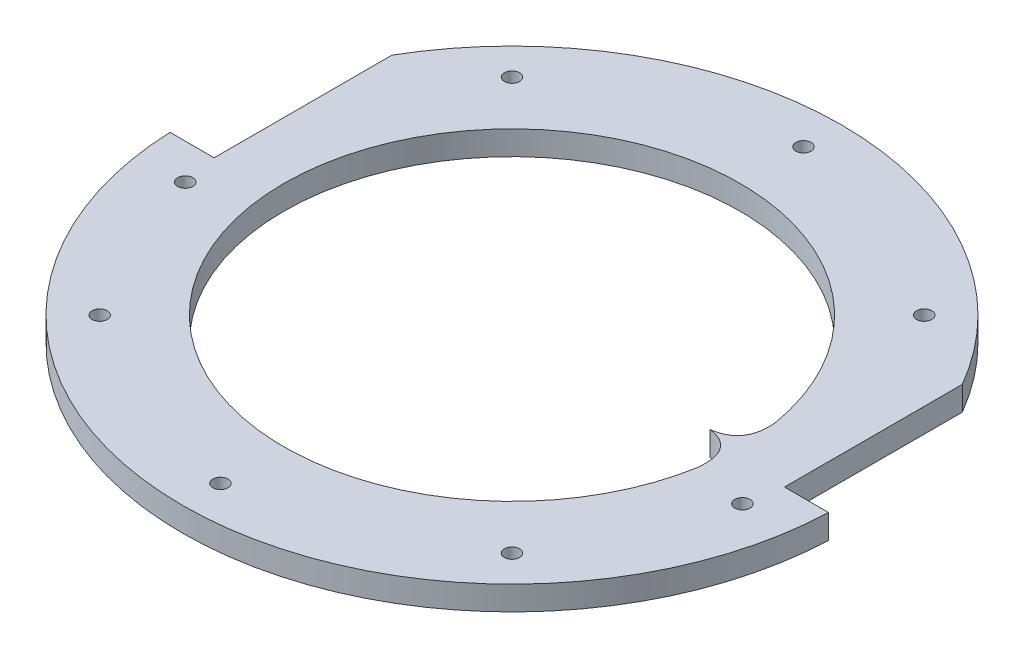
ISO-10303-21;
HEADER;
FILE_DESCRIPTION(('STEP AP214'),'2;1');
FILE_NAME('part.step','',(''),(''),'','','');
FILE_SCHEMA(('AUTOMOTIVE_DESIGN { 1 0 10303 214 1 1 1 1 }'));
ENDSEC;
DATA;
#1=APPLICATION_CONTEXT('core data for automotive mechanical design processes');
#2=APPLICATION_PROTOCOL_DEFINITION('international standard','automotive_design',2000,#1);
#3=PRODUCT_CONTEXT('',#1,'mechanical');
#4=PRODUCT('Part','Part','',(#3));
#5=PRODUCT_RELATED_PRODUCT_CATEGORY('part','',(#4));
#6=PRODUCT_DEFINITION_FORMATION('','',#4);
#7=PRODUCT_DEFINITION_CONTEXT('part definition',#1,'design');
#8=PRODUCT_DEFINITION('design','',#6,#7);
#9=PRODUCT_DEFINITION_SHAPE('','',#8);
#10=(LENGTH_UNIT() NAMED_UNIT(*) SI_UNIT(.MILLI.,.METRE.));
#11=(NAMED_UNIT(*) PLANE_ANGLE_UNIT() SI_UNIT($,.RADIAN.));
#12=(NAMED_UNIT(*) SI_UNIT($,.STERADIAN.) SOLID_ANGLE_UNIT());
#13=UNCERTAINTY_MEASURE_WITH_UNIT(LENGTH_MEASURE(1.E-05),#10,'distance_accuracy_value','');
#14=(GEOMETRIC_REPRESENTATION_CONTEXT(3) GLOBAL_UNCERTAINTY_ASSIGNED_CONTEXT((#13)) GLOBAL_UNIT_ASSIGNED_CONTEXT((#10,
#11,#12)) REPRESENTATION_CONTEXT('',''));
#15=CARTESIAN_POINT('',(0.,0.,0.));
#16=DIRECTION('',(0.,0.,1.));
#17=DIRECTION('',(1.,0.,0.));
#18=AXIS2_PLACEMENT_3D('',#15,#16,#17);
#19=CARTESIAN_POINT('',(0.,4.75,0.));
#20=DIRECTION('',(0.,1.,0.));
#21=DIRECTION('',(0.,0.,1.));
#22=AXIS2_PLACEMENT_3D('',#19,#20,#21);
#23=PLANE('',#22);
#24=CARTESIAN_POINT('',(0.,4.75,0.));
#25=DIRECTION('',(0.,1.,0.));
#26=DIRECTION('',(0.,0.,1.));
#27=AXIS2_PLACEMENT_3D('',#24,#25,#26);
#28=CIRCLE('',#27,65.);
#29=CARTESIAN_POINT('',(56.2499999999999,4.75,-32.5720355519887));
#30=VERTEX_POINT('',#29);
#31=CARTESIAN_POINT('',(-56.25,4.75,-32.5720355519884));
#32=VERTEX_POINT('',#31);
#33=EDGE_CURVE('E141',#30,#32,#28,.T.);
#34=ORIENTED_EDGE('',*,*,#33,.T.);
#35=DIRECTION('',(0.,0.,-1.));
#36=VECTOR('',#35,1.);
#37=CARTESIAN_POINT('',(-56.25,4.75,-2.50000000000001));
#38=LINE('',#37,#36);
#39=CARTESIAN_POINT('',(-56.25,4.75,2.49999999999999));
#40=VERTEX_POINT('',#39);
#41=EDGE_CURVE('E128',#40,#32,#38,.T.);
#42=ORIENTED_EDGE('',*,*,#41,.F.);
#43=DIRECTION('',(1.,0.,0.));
#44=VECTOR('',#43,1.);
#45=CARTESIAN_POINT('',(-66.25,4.75,2.5));
#46=LINE('',#45,#44);
#47=CARTESIAN_POINT('',(-64.9519052838329,4.75,2.5));
#48=VERTEX_POINT('',#47);
#49=EDGE_CURVE('E263',#48,#40,#46,.T.);
#50=ORIENTED_EDGE('',*,*,#49,.F.);
#51=CARTESIAN_POINT('',(64.9519052838329,4.75,2.49999999999955));
#52=VERTEX_POINT('',#51);
#53=EDGE_CURVE('E137',#48,#52,#28,.T.);
#54=ORIENTED_EDGE('',*,*,#53,.T.);
#55=DIRECTION('',(1.,0.,0.));
#56=VECTOR('',#55,1.);
#57=CARTESIAN_POINT('',(66.25,4.75,2.49999999999954));
#58=LINE('',#57,#56);
#59=CARTESIAN_POINT('',(56.25,4.75,2.49999999999961));
#60=VERTEX_POINT('',#59);
#61=EDGE_CURVE('E60',#60,#52,#58,.T.);
#62=ORIENTED_EDGE('',*,*,#61,.F.);
#63=DIRECTION('',(0.,0.,1.));
#64=VECTOR('',#63,1.);
#65=CARTESIAN_POINT('',(56.25,4.75,-2.50000000000039));
#66=LINE('',#65,#64);
#67=EDGE_CURVE('E158',#30,#60,#66,.T.);
#68=ORIENTED_EDGE('',*,*,#67,.F.);
#69=EDGE_LOOP('',(#34,#42,#50,#54,#62,#68));
#70=FACE_BOUND('',#69,.T.);
#71=CARTESIAN_POINT('',(0.,4.75,0.));
#72=DIRECTION('',(0.,1.,0.));
#73=DIRECTION('',(0.,0.,1.));
#74=AXIS2_PLACEMENT_3D('',#71,#72,#73);
#75=CIRCLE('',#74,45.);
#76=CARTESIAN_POINT('',(44.3497818734696,4.75,-7.62212882177071));
#77=VERTEX_POINT('',#76);
#78=CARTESIAN_POINT('',(44.3497818734695,4.75,7.62212882177072));
#79=VERTEX_POINT('',#78);
#80=EDGE_CURVE('E178',#77,#79,#75,.T.);
#81=ORIENTED_EDGE('',*,*,#80,.F.);
#82=CARTESIAN_POINT('',(39.0887878289872,4.75,0.));
#83=CARTESIAN_POINT('',(45.,4.75,-0.79500708341378));
#84=CARTESIAN_POINT('',(44.3497818734696,4.75,-7.62212882177072));
#85=B_SPLINE_CURVE_WITH_KNOTS('',2,(#82,#83,#84),.UNSPECIFIED.,.F.,.F.,(3,3),(0.,1.),.UNSPECIFIED.);
#86=CARTESIAN_POINT('',(39.0887878289872,4.75,0.));
#87=VERTEX_POINT('',#86);
#88=EDGE_CURVE('E173',#87,#77,#85,.T.);
#89=ORIENTED_EDGE('',*,*,#88,.F.);
#90=CARTESIAN_POINT('',(44.3497818734695,4.75,7.62212882177072));
#91=CARTESIAN_POINT('',(45.,4.75,0.79500708341378));
#92=CARTESIAN_POINT('',(39.0887878289872,4.75,0.));
#93=B_SPLINE_CURVE_WITH_KNOTS('',2,(#90,#91,#92),.UNSPECIFIED.,.F.,.F.,(3,3),(0.,1.),.UNSPECIFIED.);
#94=EDGE_CURVE('E324',#79,#87,#93,.T.);
#95=ORIENTED_EDGE('',*,*,#94,.F.);
#96=EDGE_LOOP('',(#81,#89,#95));
#97=FACE_BOUND('',#96,.T.);
#98=CARTESIAN_POINT('',(-40.6586399182265,4.75,40.6586399182265));
#99=DIRECTION('',(0.,1.,0.));
#100=DIRECTION('',(0.,0.,-1.));
#101=AXIS2_PLACEMENT_3D('',#98,#99,#100);
#102=CIRCLE('',#101,1.5);
#103=CARTESIAN_POINT('',(-40.6586399182265,4.75,39.1586399182265));
#104=VERTEX_POINT('',#103);
#105=EDGE_CURVE('E278',#104,#104,#102,.T.);
#106=ORIENTED_EDGE('',*,*,#105,.F.);
#107=EDGE_LOOP('',(#106));
#108=FACE_BOUND('',#107,.T.);
#109=CARTESIAN_POINT('',(0.,4.75,-57.5));
#110=DIRECTION('',(0.,1.,0.));
#111=DIRECTION('',(0.,0.,-1.));
#112=AXIS2_PLACEMENT_3D('',#109,#110,#111);
#113=CIRCLE('',#112,1.5);
#114=CARTESIAN_POINT('',(0.,4.75,-59.));
#115=VERTEX_POINT('',#114);
#116=EDGE_CURVE('E282',#115,#115,#113,.T.);
#117=ORIENTED_EDGE('',*,*,#116,.F.);
#118=EDGE_LOOP('',(#117));
#119=FACE_BOUND('',#118,.T.);
#120=CARTESIAN_POINT('',(40.6586399182265,4.75,40.6586399182265));
#121=DIRECTION('',(0.,1.,0.));
#122=DIRECTION('',(0.,0.,1.));
#123=AXIS2_PLACEMENT_3D('',#120,#121,#122);
#124=CIRCLE('',#123,1.5);
#125=CARTESIAN_POINT('',(40.6586399182265,4.75,42.1586399182265));
#126=VERTEX_POINT('',#125);
#127=EDGE_CURVE('E286',#126,#126,#124,.T.);
#128=ORIENTED_EDGE('',*,*,#127,.F.);
#129=EDGE_LOOP('',(#128));
#130=FACE_BOUND('',#129,.T.);
#131=CARTESIAN_POINT('',(0.,4.75,57.5));
#132=DIRECTION('',(0.,1.,0.));
#133=DIRECTION('',(0.,0.,1.));
#134=AXIS2_PLACEMENT_3D('',#131,#132,#133);
#135=CIRCLE('',#134,1.5);
#136=CARTESIAN_POINT('',(0.,4.75,59.));
#137=VERTEX_POINT('',#136);
#138=EDGE_CURVE('E144',#137,#137,#135,.T.);
#139=ORIENTED_EDGE('',*,*,#138,.F.);
#140=EDGE_LOOP('',(#139));
#141=FACE_BOUND('',#140,.T.);
#142=CARTESIAN_POINT('',(40.6586399182265,4.75,-40.6586399182265));
#143=DIRECTION('',(0.,1.,0.));
#144=DIRECTION('',(0.,0.,1.));
#145=AXIS2_PLACEMENT_3D('',#142,#143,#144);
#146=CIRCLE('',#145,1.5);
#147=CARTESIAN_POINT('',(40.6586399182265,4.75,-39.1586399182265));
#148=VERTEX_POINT('',#147);
#149=EDGE_CURVE('E293',#148,#148,#146,.T.);
#150=ORIENTED_EDGE('',*,*,#149,.F.);
#151=EDGE_LOOP('',(#150));
#152=FACE_BOUND('',#151,.T.);
#153=CARTESIAN_POINT('',(-40.6586399182265,4.75,-40.6586399182265));
#154=DIRECTION('',(0.,1.,0.));
#155=DIRECTION('',(0.,0.,-1.));
#156=AXIS2_PLACEMENT_3D('',#153,#154,#155);
#157=CIRCLE('',#156,1.5);
#158=CARTESIAN_POINT('',(-40.6586399182265,4.75,-42.1586399182265));
#159=VERTEX_POINT('',#158);
#160=EDGE_CURVE('E297',#159,#159,#157,.T.);
#161=ORIENTED_EDGE('',*,*,#160,.F.);
#162=EDGE_LOOP('',(#161));
#163=FACE_BOUND('',#162,.T.);
#164=CARTESIAN_POINT('',(54.9519052838329,4.75,9.49999999999961));
#165=DIRECTION('',(0.,1.,0.));
#166=DIRECTION('',(0.,0.,1.));
#167=AXIS2_PLACEMENT_3D('',#164,#165,#166);
#168=CIRCLE('',#167,1.5);
#169=CARTESIAN_POINT('',(54.9519052838329,4.75,10.9999999999996));
#170=VERTEX_POINT('',#169);
#171=EDGE_CURVE('E257',#170,#170,#168,.T.);
#172=ORIENTED_EDGE('',*,*,#171,.F.);
#173=EDGE_LOOP('',(#172));
#174=FACE_BOUND('',#173,.T.);
#175=CARTESIAN_POINT('',(-54.9519052838329,4.75,9.49999999999962));
#176=DIRECTION('',(0.,-1.,0.));
#177=DIRECTION('',(0.,0.,-1.));
#178=AXIS2_PLACEMENT_3D('',#175,#176,#177);
#179=CIRCLE('',#178,1.50000000000001);
#180=CARTESIAN_POINT('',(-54.9519052838329,4.75,7.99999999999961));
#181=VERTEX_POINT('',#180);
#182=EDGE_CURVE('E163',#181,#181,#179,.T.);
#183=ORIENTED_EDGE('',*,*,#182,.T.);
#184=EDGE_LOOP('',(#183));
#185=FACE_BOUND('',#184,.T.);
#186=ADVANCED_FACE('F45',(#70,#97,#108,#119,#130,#141,#152,#163,#174,#185),#23,.T.);
#187=CARTESIAN_POINT('',(0.,0.,0.));
#188=DIRECTION('',(0.,1.,0.));
#189=DIRECTION('',(0.,0.,1.));
#190=AXIS2_PLACEMENT_3D('',#187,#188,#189);
#191=PLANE('',#190);
#192=CARTESIAN_POINT('',(-54.9519052838329,0.,9.49999999999962));
#193=DIRECTION('',(0.,-1.,0.));
#194=DIRECTION('',(0.,0.,-1.));
#195=AXIS2_PLACEMENT_3D('',#192,#193,#194);
#196=CIRCLE('',#195,1.50000000000001);
#197=CARTESIAN_POINT('',(-54.9519052838329,0.,7.99999999999961));
#198=VERTEX_POINT('',#197);
#199=EDGE_CURVE('E159',#198,#198,#196,.T.);
#200=ORIENTED_EDGE('',*,*,#199,.F.);
#201=EDGE_LOOP('',(#200));
#202=FACE_BOUND('',#201,.T.);
#203=CARTESIAN_POINT('',(39.0887878289872,0.,0.));
#204=CARTESIAN_POINT('',(45.,0.,-0.79500708341378));
#205=CARTESIAN_POINT('',(44.3497818734696,0.,-7.62212882177072));
#206=B_SPLINE_CURVE_WITH_KNOTS('',2,(#203,#204,#205),.UNSPECIFIED.,.F.,.F.,(3,3),(0.,1.),.UNSPECIFIED.);
#207=CARTESIAN_POINT('',(39.0887878289872,0.,0.));
#208=VERTEX_POINT('',#207);
#209=CARTESIAN_POINT('',(44.3497818734696,0.,-7.62212882177071));
#210=VERTEX_POINT('',#209);
#211=EDGE_CURVE('E172',#208,#210,#206,.T.);
#212=ORIENTED_EDGE('',*,*,#211,.T.);
#213=CARTESIAN_POINT('',(0.,0.,0.));
#214=DIRECTION('',(0.,1.,0.));
#215=DIRECTION('',(0.,0.,1.));
#216=AXIS2_PLACEMENT_3D('',#213,#214,#215);
#217=CIRCLE('',#216,45.);
#218=CARTESIAN_POINT('',(44.3497818734696,0.,7.6221288217707));
#219=VERTEX_POINT('',#218);
#220=EDGE_CURVE('E336',#210,#219,#217,.T.);
#221=ORIENTED_EDGE('',*,*,#220,.T.);
#222=CARTESIAN_POINT('',(44.3497818734695,0.,7.62212882177072));
#223=CARTESIAN_POINT('',(45.,0.,0.79500708341378));
#224=CARTESIAN_POINT('',(39.0887878289872,0.,0.));
#225=B_SPLINE_CURVE_WITH_KNOTS('',2,(#222,#223,#224),.UNSPECIFIED.,.F.,.F.,(3,3),(0.,1.),.UNSPECIFIED.);
#226=EDGE_CURVE('E179',#219,#208,#225,.T.);
#227=ORIENTED_EDGE('',*,*,#226,.T.);
#228=EDGE_LOOP('',(#212,#221,#227));
#229=FACE_BOUND('',#228,.T.);
#230=CARTESIAN_POINT('',(0.,0.,57.5));
#231=DIRECTION('',(0.,1.,0.));
#232=DIRECTION('',(0.,0.,1.));
#233=AXIS2_PLACEMENT_3D('',#230,#231,#232);
#234=CIRCLE('',#233,1.5);
#235=CARTESIAN_POINT('',(0.,0.,59.));
#236=VERTEX_POINT('',#235);
#237=EDGE_CURVE('E233',#236,#236,#234,.T.);
#238=ORIENTED_EDGE('',*,*,#237,.T.);
#239=EDGE_LOOP('',(#238));
#240=FACE_BOUND('',#239,.T.);
#241=CARTESIAN_POINT('',(40.6586399182265,0.,40.6586399182265));
#242=DIRECTION('',(0.,1.,0.));
#243=DIRECTION('',(0.,0.,1.));
#244=AXIS2_PLACEMENT_3D('',#241,#242,#243);
#245=CIRCLE('',#244,1.5);
#246=CARTESIAN_POINT('',(40.6586399182265,0.,42.1586399182265));
#247=VERTEX_POINT('',#246);
#248=EDGE_CURVE('E237',#247,#247,#245,.T.);
#249=ORIENTED_EDGE('',*,*,#248,.T.);
#250=EDGE_LOOP('',(#249));
#251=FACE_BOUND('',#250,.T.);
#252=CARTESIAN_POINT('',(40.6586399182265,0.,-40.6586399182265));
#253=DIRECTION('',(0.,1.,0.));
#254=DIRECTION('',(0.,0.,1.));
#255=AXIS2_PLACEMENT_3D('',#252,#253,#254);
#256=CIRCLE('',#255,1.5);
#257=CARTESIAN_POINT('',(40.6586399182265,0.,-39.1586399182265));
#258=VERTEX_POINT('',#257);
#259=EDGE_CURVE('E241',#258,#258,#256,.T.);
#260=ORIENTED_EDGE('',*,*,#259,.T.);
#261=EDGE_LOOP('',(#260));
#262=FACE_BOUND('',#261,.T.);
#263=CARTESIAN_POINT('',(0.,0.,-57.5));
#264=DIRECTION('',(0.,1.,0.));
#265=DIRECTION('',(0.,0.,-1.));
#266=AXIS2_PLACEMENT_3D('',#263,#264,#265);
#267=CIRCLE('',#266,1.5);
#268=CARTESIAN_POINT('',(0.,0.,-59.));
#269=VERTEX_POINT('',#268);
#270=EDGE_CURVE('E245',#269,#269,#267,.T.);
#271=ORIENTED_EDGE('',*,*,#270,.T.);
#272=EDGE_LOOP('',(#271));
#273=FACE_BOUND('',#272,.T.);
#274=CARTESIAN_POINT('',(-40.6586399182265,0.,-40.6586399182265));
#275=DIRECTION('',(0.,1.,0.));
#276=DIRECTION('',(0.,0.,-1.));
#277=AXIS2_PLACEMENT_3D('',#274,#275,#276);
#278=CIRCLE('',#277,1.5);
#279=CARTESIAN_POINT('',(-40.6586399182265,0.,-42.1586399182265));
#280=VERTEX_POINT('',#279);
#281=EDGE_CURVE('E249',#280,#280,#278,.T.);
#282=ORIENTED_EDGE('',*,*,#281,.T.);
#283=EDGE_LOOP('',(#282));
#284=FACE_BOUND('',#283,.T.);
#285=CARTESIAN_POINT('',(-40.6586399182265,0.,40.6586399182265));
#286=DIRECTION('',(0.,1.,0.));
#287=DIRECTION('',(0.,0.,-1.));
#288=AXIS2_PLACEMENT_3D('',#285,#286,#287);
#289=CIRCLE('',#288,1.5);
#290=CARTESIAN_POINT('',(-40.6586399182265,0.,39.1586399182265));
#291=VERTEX_POINT('',#290);
#292=EDGE_CURVE('E253',#291,#291,#289,.T.);
#293=ORIENTED_EDGE('',*,*,#292,.T.);
#294=EDGE_LOOP('',(#293));
#295=FACE_BOUND('',#294,.T.);
#296=CARTESIAN_POINT('',(54.9519052838329,0.,9.49999999999961));
#297=DIRECTION('',(0.,1.,0.));
#298=DIRECTION('',(0.,0.,1.));
#299=AXIS2_PLACEMENT_3D('',#296,#297,#298);
#300=CIRCLE('',#299,1.5);
#301=CARTESIAN_POINT('',(54.9519052838329,0.,10.9999999999996));
#302=VERTEX_POINT('',#301);
#303=EDGE_CURVE('E132',#302,#302,#300,.T.);
#304=ORIENTED_EDGE('',*,*,#303,.T.);
#305=EDGE_LOOP('',(#304));
#306=FACE_BOUND('',#305,.T.);
#307=DIRECTION('',(0.,0.,-1.));
#308=VECTOR('',#307,1.);
#309=CARTESIAN_POINT('',(-56.25,0.,0.));
#310=LINE('',#309,#308);
#311=CARTESIAN_POINT('',(-56.25,0.,2.49999999999999));
#312=VERTEX_POINT('',#311);
#313=CARTESIAN_POINT('',(-56.25,0.,-32.5720355519884));
#314=VERTEX_POINT('',#313);
#315=EDGE_CURVE('E12',#312,#314,#310,.T.);
#316=ORIENTED_EDGE('',*,*,#315,.T.);
#317=CARTESIAN_POINT('',(0.,0.,0.));
#318=DIRECTION('',(0.,1.,0.));
#319=DIRECTION('',(0.,0.,1.));
#320=AXIS2_PLACEMENT_3D('',#317,#318,#319);
#321=CIRCLE('',#320,65.);
#322=CARTESIAN_POINT('',(56.2499999999999,0.,-32.5720355519887));
#323=VERTEX_POINT('',#322);
#324=EDGE_CURVE('E119',#323,#314,#321,.T.);
#325=ORIENTED_EDGE('',*,*,#324,.F.);
#326=DIRECTION('',(0.,0.,1.));
#327=VECTOR('',#326,1.);
#328=CARTESIAN_POINT('',(56.25,0.,-4.68375338513738E-13));
#329=LINE('',#328,#327);
#330=CARTESIAN_POINT('',(56.25,0.,2.49999999999961));
#331=VERTEX_POINT('',#330);
#332=EDGE_CURVE('E53',#323,#331,#329,.T.);
#333=ORIENTED_EDGE('',*,*,#332,.T.);
#334=DIRECTION('',(1.,0.,0.));
#335=VECTOR('',#334,1.);
#336=CARTESIAN_POINT('',(0.,0.,2.49999999999999));
#337=LINE('',#336,#335);
#338=CARTESIAN_POINT('',(64.9519052838329,0.,2.49999999999955));
#339=VERTEX_POINT('',#338);
#340=EDGE_CURVE('E152',#331,#339,#337,.T.);
#341=ORIENTED_EDGE('',*,*,#340,.T.);
#342=CARTESIAN_POINT('',(-64.9519052838329,0.,2.5));
#343=VERTEX_POINT('',#342);
#344=EDGE_CURVE('E138',#343,#339,#321,.T.);
#345=ORIENTED_EDGE('',*,*,#344,.F.);
#346=DIRECTION('',(1.,0.,0.));
#347=VECTOR('',#346,1.);
#348=CARTESIAN_POINT('',(0.,0.,2.49999999999998));
#349=LINE('',#348,#347);
#350=EDGE_CURVE('E121',#343,#312,#349,.T.);
#351=ORIENTED_EDGE('',*,*,#350,.T.);
#352=EDGE_LOOP('',(#316,#325,#333,#341,#345,#351));
#353=FACE_BOUND('',#352,.T.);
#354=ADVANCED_FACE('F116',(#202,#229,#240,#251,#262,#273,#284,#295,#306,#353),#191,.F.);
#355=CARTESIAN_POINT('',(0.,4.75,0.));
#356=DIRECTION('',(0.,-1.,0.));
#357=DIRECTION('',(0.,0.,-1.));
#358=AXIS2_PLACEMENT_3D('',#355,#356,#357);
#359=CYLINDRICAL_SURFACE('',#358,65.);
#360=ORIENTED_EDGE('',*,*,#324,.T.);
#361=DIRECTION('',(0.,1.,0.));
#362=VECTOR('',#361,1.);
#363=CARTESIAN_POINT('',(-56.25,0.,-32.5720355519884));
#364=LINE('',#363,#362);
#365=EDGE_CURVE('E125',#314,#32,#364,.T.);
#366=ORIENTED_EDGE('',*,*,#365,.T.);
#367=ORIENTED_EDGE('',*,*,#33,.F.);
#368=DIRECTION('',(0.,1.,0.));
#369=VECTOR('',#368,1.);
#370=CARTESIAN_POINT('',(56.2499999999999,0.,-32.5720355519887));
#371=LINE('',#370,#369);
#372=EDGE_CURVE('E133',#323,#30,#371,.T.);
#373=ORIENTED_EDGE('',*,*,#372,.F.);
#374=EDGE_LOOP('',(#360,#366,#367,#373));
#375=FACE_BOUND('',#374,.T.);
#376=ADVANCED_FACE('F47',(#375),#359,.T.);
#377=ORIENTED_EDGE('',*,*,#53,.F.);
#378=DIRECTION('',(0.,-1.,0.));
#379=VECTOR('',#378,1.);
#380=CARTESIAN_POINT('',(-64.9519052838329,4.75,2.5));
#381=LINE('',#380,#379);
#382=EDGE_CURVE('E149',#48,#343,#381,.T.);
#383=ORIENTED_EDGE('',*,*,#382,.T.);
#384=ORIENTED_EDGE('',*,*,#344,.T.);
#385=DIRECTION('',(0.,-1.,0.));
#386=VECTOR('',#385,1.);
#387=CARTESIAN_POINT('',(64.9519052838329,4.75,2.49999999999955));
#388=LINE('',#387,#386);
#389=EDGE_CURVE('E147',#339,#52,#388,.F.);
#390=ORIENTED_EDGE('',*,*,#389,.T.);
#391=EDGE_LOOP('',(#377,#383,#384,#390));
#392=FACE_BOUND('',#391,.T.);
#393=ADVANCED_FACE('F215',(#392),#359,.T.);
#394=CARTESIAN_POINT('',(0.,4.75,57.5));
#395=DIRECTION('',(0.,-1.,0.));
#396=DIRECTION('',(0.,0.,-1.));
#397=AXIS2_PLACEMENT_3D('',#394,#395,#396);
#398=CYLINDRICAL_SURFACE('',#397,1.5);
#399=ORIENTED_EDGE('',*,*,#138,.T.);
#400=EDGE_LOOP('',(#399));
#401=FACE_BOUND('',#400,.T.);
#402=ORIENTED_EDGE('',*,*,#237,.F.);
#403=EDGE_LOOP('',(#402));
#404=FACE_BOUND('',#403,.T.);
#405=ADVANCED_FACE('F211',(#401,#404),#398,.F.);
#406=CARTESIAN_POINT('',(40.6586399182265,4.75,40.6586399182265));
#407=DIRECTION('',(0.,-1.,0.));
#408=DIRECTION('',(0.,0.,-1.));
#409=AXIS2_PLACEMENT_3D('',#406,#407,#408);
#410=CYLINDRICAL_SURFACE('',#409,1.5);
#411=ORIENTED_EDGE('',*,*,#127,.T.);
#412=EDGE_LOOP('',(#411));
#413=FACE_BOUND('',#412,.T.);
#414=ORIENTED_EDGE('',*,*,#248,.F.);
#415=EDGE_LOOP('',(#414));
#416=FACE_BOUND('',#415,.T.);
#417=ADVANCED_FACE('F207',(#413,#416),#410,.F.);
#418=CARTESIAN_POINT('',(40.6586399182265,4.75,-40.6586399182265));
#419=DIRECTION('',(0.,-1.,0.));
#420=DIRECTION('',(0.,0.,-1.));
#421=AXIS2_PLACEMENT_3D('',#418,#419,#420);
#422=CYLINDRICAL_SURFACE('',#421,1.5);
#423=ORIENTED_EDGE('',*,*,#149,.T.);
#424=EDGE_LOOP('',(#423));
#425=FACE_BOUND('',#424,.T.);
#426=ORIENTED_EDGE('',*,*,#259,.F.);
#427=EDGE_LOOP('',(#426));
#428=FACE_BOUND('',#427,.T.);
#429=ADVANCED_FACE('F203',(#425,#428),#422,.F.);
#430=CARTESIAN_POINT('',(0.,4.75,-57.5));
#431=DIRECTION('',(0.,-1.,0.));
#432=DIRECTION('',(0.,0.,-1.));
#433=AXIS2_PLACEMENT_3D('',#430,#431,#432);
#434=CYLINDRICAL_SURFACE('',#433,1.5);
#435=ORIENTED_EDGE('',*,*,#116,.T.);
#436=EDGE_LOOP('',(#435));
#437=FACE_BOUND('',#436,.T.);
#438=ORIENTED_EDGE('',*,*,#270,.F.);
#439=EDGE_LOOP('',(#438));
#440=FACE_BOUND('',#439,.T.);
#441=ADVANCED_FACE('F199',(#437,#440),#434,.F.);
#442=CARTESIAN_POINT('',(-40.6586399182265,4.75,-40.6586399182265));
#443=DIRECTION('',(0.,-1.,0.));
#444=DIRECTION('',(0.,0.,-1.));
#445=AXIS2_PLACEMENT_3D('',#442,#443,#444);
#446=CYLINDRICAL_SURFACE('',#445,1.5);
#447=ORIENTED_EDGE('',*,*,#160,.T.);
#448=EDGE_LOOP('',(#447));
#449=FACE_BOUND('',#448,.T.);
#450=ORIENTED_EDGE('',*,*,#281,.F.);
#451=EDGE_LOOP('',(#450));
#452=FACE_BOUND('',#451,.T.);
#453=ADVANCED_FACE('F195',(#449,#452),#446,.F.);
#454=CARTESIAN_POINT('',(-40.6586399182265,4.75,40.6586399182265));
#455=DIRECTION('',(0.,-1.,0.));
#456=DIRECTION('',(0.,0.,-1.));
#457=AXIS2_PLACEMENT_3D('',#454,#455,#456);
#458=CYLINDRICAL_SURFACE('',#457,1.5);
#459=ORIENTED_EDGE('',*,*,#105,.T.);
#460=EDGE_LOOP('',(#459));
#461=FACE_BOUND('',#460,.T.);
#462=ORIENTED_EDGE('',*,*,#292,.F.);
#463=EDGE_LOOP('',(#462));
#464=FACE_BOUND('',#463,.T.);
#465=ADVANCED_FACE('F190',(#461,#464),#458,.F.);
#466=DIRECTION('',(0.,-1.,0.));
#467=VECTOR('',#466,1.);
#468=SURFACE_OF_LINEAR_EXTRUSION('',#85,#467);
#469=ORIENTED_EDGE('',*,*,#211,.F.);
#470=DIRECTION('',(0.,-1.,0.));
#471=VECTOR('',#470,1.);
#472=CARTESIAN_POINT('',(39.0887878289872,4.75,0.));
#473=LINE('',#472,#471);
#474=EDGE_CURVE('E329',#87,#208,#473,.T.);
#475=ORIENTED_EDGE('',*,*,#474,.F.);
#476=ORIENTED_EDGE('',*,*,#88,.T.);
#477=DIRECTION('',(0.,-1.,0.));
#478=VECTOR('',#477,1.);
#479=CARTESIAN_POINT('',(44.3497818734696,4.75,-7.62212882177071));
#480=LINE('',#479,#478);
#481=EDGE_CURVE('E350',#77,#210,#480,.T.);
#482=ORIENTED_EDGE('',*,*,#481,.T.);
#483=EDGE_LOOP('',(#469,#475,#476,#482));
#484=FACE_BOUND('',#483,.T.);
#485=ADVANCED_FACE('F185',(#484),#468,.T.);
#486=CARTESIAN_POINT('',(0.,4.75,0.));
#487=DIRECTION('',(0.,-1.,0.));
#488=DIRECTION('',(0.,0.,-1.));
#489=AXIS2_PLACEMENT_3D('',#486,#487,#488);
#490=CYLINDRICAL_SURFACE('',#489,45.);
#491=ORIENTED_EDGE('',*,*,#220,.F.);
#492=ORIENTED_EDGE('',*,*,#481,.F.);
#493=ORIENTED_EDGE('',*,*,#80,.T.);
#494=DIRECTION('',(0.,-1.,0.));
#495=VECTOR('',#494,1.);
#496=CARTESIAN_POINT('',(44.3497818734696,4.75,7.6221288217707));
#497=LINE('',#496,#495);
#498=EDGE_CURVE('E68',#79,#219,#497,.T.);
#499=ORIENTED_EDGE('',*,*,#498,.T.);
#500=EDGE_LOOP('',(#491,#492,#493,#499));
#501=FACE_BOUND('',#500,.T.);
#502=ADVANCED_FACE('F189',(#501),#490,.F.);
#503=DIRECTION('',(0.,-1.,0.));
#504=VECTOR('',#503,1.);
#505=SURFACE_OF_LINEAR_EXTRUSION('',#93,#504);
#506=ORIENTED_EDGE('',*,*,#226,.F.);
#507=ORIENTED_EDGE('',*,*,#498,.F.);
#508=ORIENTED_EDGE('',*,*,#94,.T.);
#509=ORIENTED_EDGE('',*,*,#474,.T.);
#510=EDGE_LOOP('',(#506,#507,#508,#509));
#511=FACE_BOUND('',#510,.T.);
#512=ADVANCED_FACE('F321',(#511),#505,.T.);
#513=CARTESIAN_POINT('',(56.25,-0.25,-2.50000000000039));
#514=DIRECTION('',(-1.,0.,0.));
#515=DIRECTION('',(0.,0.,1.));
#516=AXIS2_PLACEMENT_3D('',#513,#514,#515);
#517=PLANE('',#516);
#518=ORIENTED_EDGE('',*,*,#332,.F.);
#519=ORIENTED_EDGE('',*,*,#372,.T.);
#520=ORIENTED_EDGE('',*,*,#67,.T.);
#521=DIRECTION('',(0.,1.,0.));
#522=VECTOR('',#521,1.);
#523=CARTESIAN_POINT('',(56.25,-0.25,2.49999999999961));
#524=LINE('',#523,#522);
#525=EDGE_CURVE('E157',#331,#60,#524,.T.);
#526=ORIENTED_EDGE('',*,*,#525,.F.);
#527=EDGE_LOOP('',(#518,#519,#520,#526));
#528=FACE_BOUND('',#527,.T.);
#529=ADVANCED_FACE('F155',(#528),#517,.F.);
#530=CARTESIAN_POINT('',(66.25,-0.25,2.49999999999954));
#531=DIRECTION('',(0.,0.,1.));
#532=DIRECTION('',(1.,0.,0.));
#533=AXIS2_PLACEMENT_3D('',#530,#531,#532);
#534=PLANE('',#533);
#535=ORIENTED_EDGE('',*,*,#525,.T.);
#536=ORIENTED_EDGE('',*,*,#61,.T.);
#537=ORIENTED_EDGE('',*,*,#389,.F.);
#538=ORIENTED_EDGE('',*,*,#340,.F.);
#539=EDGE_LOOP('',(#535,#536,#537,#538));
#540=FACE_BOUND('',#539,.T.);
#541=ADVANCED_FACE('F318',(#540),#534,.F.);
#542=CARTESIAN_POINT('',(-56.25,-0.25,-2.50000000000001));
#543=DIRECTION('',(1.,0.,0.));
#544=DIRECTION('',(0.,0.,-1.));
#545=AXIS2_PLACEMENT_3D('',#542,#543,#544);
#546=PLANE('',#545);
#547=DIRECTION('',(0.,1.,0.));
#548=VECTOR('',#547,1.);
#549=CARTESIAN_POINT('',(-56.25,-0.25,2.49999999999999));
#550=LINE('',#549,#548);
#551=EDGE_CURVE('E166',#312,#40,#550,.T.);
#552=ORIENTED_EDGE('',*,*,#551,.T.);
#553=ORIENTED_EDGE('',*,*,#41,.T.);
#554=ORIENTED_EDGE('',*,*,#365,.F.);
#555=ORIENTED_EDGE('',*,*,#315,.F.);
#556=EDGE_LOOP('',(#552,#553,#554,#555));
#557=FACE_BOUND('',#556,.T.);
#558=ADVANCED_FACE('F126',(#557),#546,.F.);
#559=CARTESIAN_POINT('',(-66.25,-0.25,2.5));
#560=DIRECTION('',(0.,0.,1.));
#561=DIRECTION('',(1.,0.,0.));
#562=AXIS2_PLACEMENT_3D('',#559,#560,#561);
#563=PLANE('',#562);
#564=ORIENTED_EDGE('',*,*,#382,.F.);
#565=ORIENTED_EDGE('',*,*,#49,.T.);
#566=ORIENTED_EDGE('',*,*,#551,.F.);
#567=ORIENTED_EDGE('',*,*,#350,.F.);
#568=EDGE_LOOP('',(#564,#565,#566,#567));
#569=FACE_BOUND('',#568,.T.);
#570=ADVANCED_FACE('F267',(#569),#563,.F.);
#571=CARTESIAN_POINT('',(54.9519052838329,0.,9.49999999999961));
#572=DIRECTION('',(0.,1.,0.));
#573=DIRECTION('',(0.,0.,1.));
#574=AXIS2_PLACEMENT_3D('',#571,#572,#573);
#575=CYLINDRICAL_SURFACE('',#574,1.5);
#576=ORIENTED_EDGE('',*,*,#303,.F.);
#577=EDGE_LOOP('',(#576));
#578=FACE_BOUND('',#577,.T.);
#579=ORIENTED_EDGE('',*,*,#171,.T.);
#580=EDGE_LOOP('',(#579));
#581=FACE_BOUND('',#580,.T.);
#582=ADVANCED_FACE('F306',(#578,#581),#575,.F.);
#583=CARTESIAN_POINT('',(-54.9519052838329,0.,9.49999999999962));
#584=DIRECTION('',(0.,1.,0.));
#585=DIRECTION('',(0.,0.,1.));
#586=AXIS2_PLACEMENT_3D('',#583,#584,#585);
#587=CYLINDRICAL_SURFACE('',#586,1.50000000000001);
#588=ORIENTED_EDGE('',*,*,#199,.T.);
#589=EDGE_LOOP('',(#588));
#590=FACE_BOUND('',#589,.T.);
#591=ORIENTED_EDGE('',*,*,#182,.F.);
#592=EDGE_LOOP('',(#591));
#593=FACE_BOUND('',#592,.T.);
#594=ADVANCED_FACE('F304',(#590,#593),#587,.F.);
#595=CLOSED_SHELL('',(#186,#354,#376,#393,#405,#417,#429,#441,#453,#465,#485,#502,#512,#529,
#541,#558,#570,#582,#594));
#596=MANIFOLD_SOLID_BREP('B2',#595);
#597=ADVANCED_BREP_SHAPE_REPRESENTATION('',(#18,#596),#14);
#598=SHAPE_DEFINITION_REPRESENTATION(#9,#597);
ENDSEC;
END-ISO-10303-21;
